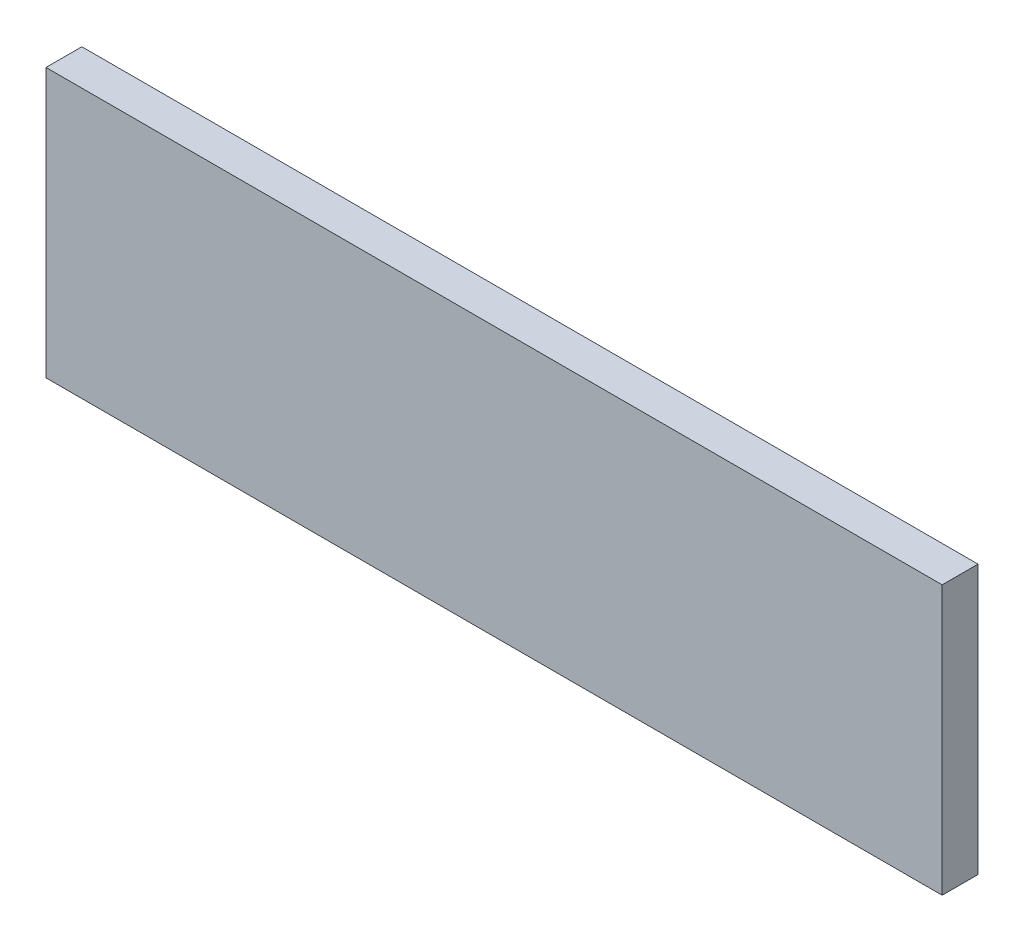
ISO-10303-21;
HEADER;
FILE_DESCRIPTION(('STEP AP214'),'2;1');
FILE_NAME('part.step','',(''),(''),'','','');
FILE_SCHEMA(('AUTOMOTIVE_DESIGN { 1 0 10303 214 1 1 1 1 }'));
ENDSEC;
DATA;
#1=APPLICATION_CONTEXT('core data for automotive mechanical design processes');
#2=APPLICATION_PROTOCOL_DEFINITION('international standard','automotive_design',2000,#1);
#3=PRODUCT_CONTEXT('',#1,'mechanical');
#4=PRODUCT('Part','Part','',(#3));
#5=PRODUCT_RELATED_PRODUCT_CATEGORY('part','',(#4));
#6=PRODUCT_DEFINITION_FORMATION('','',#4);
#7=PRODUCT_DEFINITION_CONTEXT('part definition',#1,'design');
#8=PRODUCT_DEFINITION('design','',#6,#7);
#9=PRODUCT_DEFINITION_SHAPE('','',#8);
#10=(LENGTH_UNIT() NAMED_UNIT(*) SI_UNIT(.MILLI.,.METRE.));
#11=(NAMED_UNIT(*) PLANE_ANGLE_UNIT() SI_UNIT($,.RADIAN.));
#12=(NAMED_UNIT(*) SI_UNIT($,.STERADIAN.) SOLID_ANGLE_UNIT());
#13=UNCERTAINTY_MEASURE_WITH_UNIT(LENGTH_MEASURE(1.E-05),#10,'distance_accuracy_value','');
#14=(GEOMETRIC_REPRESENTATION_CONTEXT(3) GLOBAL_UNCERTAINTY_ASSIGNED_CONTEXT((#13)) GLOBAL_UNIT_ASSIGNED_CONTEXT((#10,
#11,#12)) REPRESENTATION_CONTEXT('',''));
#15=CARTESIAN_POINT('',(0.,0.,0.));
#16=DIRECTION('',(0.,0.,1.));
#17=DIRECTION('',(1.,0.,0.));
#18=AXIS2_PLACEMENT_3D('',#15,#16,#17);
#19=CARTESIAN_POINT('',(-64.5454545454545,11.4335664335664,4.));
#20=DIRECTION('',(1.,0.,0.));
#21=DIRECTION('',(0.,1.,0.));
#22=AXIS2_PLACEMENT_3D('',#19,#20,#21);
#23=PLANE('',#22);
#24=DIRECTION('',(0.,-1.,0.));
#25=VECTOR('',#24,1.);
#26=CARTESIAN_POINT('',(-64.5454545454545,11.4335664335664,0.));
#27=LINE('',#26,#25);
#28=CARTESIAN_POINT('',(-64.5454545454545,11.4335664335664,0.));
#29=VERTEX_POINT('',#28);
#30=CARTESIAN_POINT('',(-64.5454545454545,-18.5664335664336,0.));
#31=VERTEX_POINT('',#30);
#32=EDGE_CURVE('E96',#29,#31,#27,.T.);
#33=ORIENTED_EDGE('',*,*,#32,.T.);
#34=DIRECTION('',(0.,0.,-1.));
#35=VECTOR('',#34,1.);
#36=CARTESIAN_POINT('',(-64.5454545454545,-18.5664335664336,4.));
#37=LINE('',#36,#35);
#38=CARTESIAN_POINT('',(-64.5454545454545,-18.5664335664336,4.));
#39=VERTEX_POINT('',#38);
#40=EDGE_CURVE('E11',#39,#31,#37,.T.);
#41=ORIENTED_EDGE('',*,*,#40,.F.);
#42=DIRECTION('',(0.,-1.,0.));
#43=VECTOR('',#42,1.);
#44=CARTESIAN_POINT('',(-64.5454545454545,11.4335664335664,4.));
#45=LINE('',#44,#43);
#46=CARTESIAN_POINT('',(-64.5454545454545,11.4335664335664,4.));
#47=VERTEX_POINT('',#46);
#48=EDGE_CURVE('E84',#47,#39,#45,.T.);
#49=ORIENTED_EDGE('',*,*,#48,.F.);
#50=DIRECTION('',(0.,0.,-1.));
#51=VECTOR('',#50,1.);
#52=CARTESIAN_POINT('',(-64.5454545454545,11.4335664335664,4.));
#53=LINE('',#52,#51);
#54=EDGE_CURVE('E92',#47,#29,#53,.T.);
#55=ORIENTED_EDGE('',*,*,#54,.T.);
#56=EDGE_LOOP('',(#33,#41,#49,#55));
#57=FACE_BOUND('',#56,.T.);
#58=ADVANCED_FACE('F33',(#57),#23,.F.);
#59=CARTESIAN_POINT('',(-64.5454545454545,-18.5664335664336,4.));
#60=DIRECTION('',(0.,1.,0.));
#61=DIRECTION('',(-1.,0.,0.));
#62=AXIS2_PLACEMENT_3D('',#59,#60,#61);
#63=PLANE('',#62);
#64=DIRECTION('',(1.,0.,0.));
#65=VECTOR('',#64,1.);
#66=CARTESIAN_POINT('',(-64.5454545454545,-18.5664335664336,0.));
#67=LINE('',#66,#65);
#68=CARTESIAN_POINT('',(35.4545454545455,-18.5664335664336,0.));
#69=VERTEX_POINT('',#68);
#70=EDGE_CURVE('E88',#31,#69,#67,.T.);
#71=ORIENTED_EDGE('',*,*,#70,.T.);
#72=DIRECTION('',(0.,0.,-1.));
#73=VECTOR('',#72,1.);
#74=CARTESIAN_POINT('',(35.4545454545455,-18.5664335664336,4.));
#75=LINE('',#74,#73);
#76=CARTESIAN_POINT('',(35.4545454545455,-18.5664335664336,4.));
#77=VERTEX_POINT('',#76);
#78=EDGE_CURVE('E41',#77,#69,#75,.T.);
#79=ORIENTED_EDGE('',*,*,#78,.F.);
#80=DIRECTION('',(1.,0.,0.));
#81=VECTOR('',#80,1.);
#82=CARTESIAN_POINT('',(-64.5454545454545,-18.5664335664336,4.));
#83=LINE('',#82,#81);
#84=EDGE_CURVE('E79',#39,#77,#83,.T.);
#85=ORIENTED_EDGE('',*,*,#84,.F.);
#86=ORIENTED_EDGE('',*,*,#40,.T.);
#87=EDGE_LOOP('',(#71,#79,#85,#86));
#88=FACE_BOUND('',#87,.T.);
#89=ADVANCED_FACE('F87',(#88),#63,.F.);
#90=CARTESIAN_POINT('',(35.4545454545455,11.4335664335664,4.));
#91=DIRECTION('',(-1.,0.,0.));
#92=DIRECTION('',(0.,0.,1.));
#93=AXIS2_PLACEMENT_3D('',#90,#91,#92);
#94=PLANE('',#93);
#95=DIRECTION('',(0.,1.,0.));
#96=VECTOR('',#95,1.);
#97=CARTESIAN_POINT('',(35.4545454545455,11.4335664335664,0.));
#98=LINE('',#97,#96);
#99=CARTESIAN_POINT('',(35.4545454545455,11.4335664335664,0.));
#100=VERTEX_POINT('',#99);
#101=EDGE_CURVE('E66',#69,#100,#98,.T.);
#102=ORIENTED_EDGE('',*,*,#101,.T.);
#103=DIRECTION('',(0.,0.,-1.));
#104=VECTOR('',#103,1.);
#105=CARTESIAN_POINT('',(35.4545454545455,11.4335664335664,4.));
#106=LINE('',#105,#104);
#107=CARTESIAN_POINT('',(35.4545454545455,11.4335664335664,4.));
#108=VERTEX_POINT('',#107);
#109=EDGE_CURVE('E89',#108,#100,#106,.T.);
#110=ORIENTED_EDGE('',*,*,#109,.F.);
#111=DIRECTION('',(0.,1.,0.));
#112=VECTOR('',#111,1.);
#113=CARTESIAN_POINT('',(35.4545454545455,11.4335664335664,4.));
#114=LINE('',#113,#112);
#115=EDGE_CURVE('E82',#77,#108,#114,.T.);
#116=ORIENTED_EDGE('',*,*,#115,.F.);
#117=ORIENTED_EDGE('',*,*,#78,.T.);
#118=EDGE_LOOP('',(#102,#110,#116,#117));
#119=FACE_BOUND('',#118,.T.);
#120=ADVANCED_FACE('F90',(#119),#94,.F.);
#121=CARTESIAN_POINT('',(-64.5454545454545,11.4335664335664,4.));
#122=DIRECTION('',(0.,-1.,0.));
#123=DIRECTION('',(0.,0.,-1.));
#124=AXIS2_PLACEMENT_3D('',#121,#122,#123);
#125=PLANE('',#124);
#126=DIRECTION('',(-1.,0.,0.));
#127=VECTOR('',#126,1.);
#128=CARTESIAN_POINT('',(-64.5454545454545,11.4335664335664,0.));
#129=LINE('',#128,#127);
#130=EDGE_CURVE('E72',#100,#29,#129,.T.);
#131=ORIENTED_EDGE('',*,*,#130,.T.);
#132=ORIENTED_EDGE('',*,*,#54,.F.);
#133=DIRECTION('',(-1.,0.,0.));
#134=VECTOR('',#133,1.);
#135=CARTESIAN_POINT('',(-64.5454545454545,11.4335664335664,4.));
#136=LINE('',#135,#134);
#137=EDGE_CURVE('E49',#108,#47,#136,.T.);
#138=ORIENTED_EDGE('',*,*,#137,.F.);
#139=ORIENTED_EDGE('',*,*,#109,.T.);
#140=EDGE_LOOP('',(#131,#132,#138,#139));
#141=FACE_BOUND('',#140,.T.);
#142=ADVANCED_FACE('F103',(#141),#125,.F.);
#143=CARTESIAN_POINT('',(0.,0.,4.));
#144=DIRECTION('',(0.,0.,1.));
#145=DIRECTION('',(1.,0.,0.));
#146=AXIS2_PLACEMENT_3D('',#143,#144,#145);
#147=PLANE('',#146);
#148=ORIENTED_EDGE('',*,*,#48,.T.);
#149=ORIENTED_EDGE('',*,*,#84,.T.);
#150=ORIENTED_EDGE('',*,*,#115,.T.);
#151=ORIENTED_EDGE('',*,*,#137,.T.);
#152=EDGE_LOOP('',(#148,#149,#150,#151));
#153=FACE_BOUND('',#152,.T.);
#154=ADVANCED_FACE('F80',(#153),#147,.T.);
#155=CARTESIAN_POINT('',(0.,0.,0.));
#156=DIRECTION('',(0.,0.,1.));
#157=DIRECTION('',(1.,0.,0.));
#158=AXIS2_PLACEMENT_3D('',#155,#156,#157);
#159=PLANE('',#158);
#160=ORIENTED_EDGE('',*,*,#32,.F.);
#161=ORIENTED_EDGE('',*,*,#130,.F.);
#162=ORIENTED_EDGE('',*,*,#101,.F.);
#163=ORIENTED_EDGE('',*,*,#70,.F.);
#164=EDGE_LOOP('',(#160,#161,#162,#163));
#165=FACE_BOUND('',#164,.T.);
#166=ADVANCED_FACE('F106',(#165),#159,.F.);
#167=CLOSED_SHELL('',(#58,#89,#120,#142,#154,#166));
#168=MANIFOLD_SOLID_BREP('B2',#167);
#169=ADVANCED_BREP_SHAPE_REPRESENTATION('',(#18,#168),#14);
#170=SHAPE_DEFINITION_REPRESENTATION(#9,#169);
ENDSEC;
END-ISO-10303-21;
